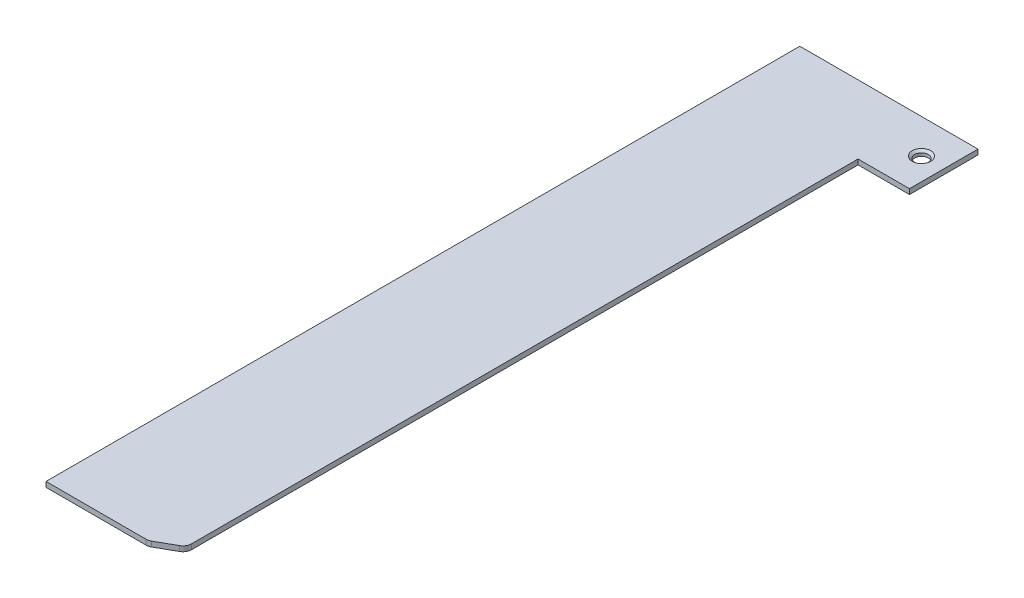
ISO-10303-21;
HEADER;
FILE_DESCRIPTION(('STEP AP214'),'2;1');
FILE_NAME('part.step','',(''),(''),'','','');
FILE_SCHEMA(('AUTOMOTIVE_DESIGN { 1 0 10303 214 1 1 1 1 }'));
ENDSEC;
DATA;
#1=APPLICATION_CONTEXT('core data for automotive mechanical design processes');
#2=APPLICATION_PROTOCOL_DEFINITION('international standard','automotive_design',2000,#1);
#3=PRODUCT_CONTEXT('',#1,'mechanical');
#4=PRODUCT('Part','Part','',(#3));
#5=PRODUCT_RELATED_PRODUCT_CATEGORY('part','',(#4));
#6=PRODUCT_DEFINITION_FORMATION('','',#4);
#7=PRODUCT_DEFINITION_CONTEXT('part definition',#1,'design');
#8=PRODUCT_DEFINITION('design','',#6,#7);
#9=PRODUCT_DEFINITION_SHAPE('','',#8);
#10=(LENGTH_UNIT() NAMED_UNIT(*) SI_UNIT(.MILLI.,.METRE.));
#11=(NAMED_UNIT(*) PLANE_ANGLE_UNIT() SI_UNIT($,.RADIAN.));
#12=(NAMED_UNIT(*) SI_UNIT($,.STERADIAN.) SOLID_ANGLE_UNIT());
#13=UNCERTAINTY_MEASURE_WITH_UNIT(LENGTH_MEASURE(1.E-05),#10,'distance_accuracy_value','');
#14=(GEOMETRIC_REPRESENTATION_CONTEXT(3) GLOBAL_UNCERTAINTY_ASSIGNED_CONTEXT((#13)) GLOBAL_UNIT_ASSIGNED_CONTEXT((#10,
#11,#12)) REPRESENTATION_CONTEXT('',''));
#15=CARTESIAN_POINT('',(0.,0.,0.));
#16=DIRECTION('',(0.,0.,1.));
#17=DIRECTION('',(1.,0.,0.));
#18=AXIS2_PLACEMENT_3D('',#15,#16,#17);
#19=CARTESIAN_POINT('',(21.4776794472939,10.,215.));
#20=DIRECTION('',(0.,-1.,0.));
#21=DIRECTION('',(0.,0.,-1.));
#22=AXIS2_PLACEMENT_3D('',#19,#20,#21);
#23=CYLINDRICAL_SURFACE('',#22,5.);
#24=DIRECTION('',(0.,-1.,0.));
#25=VECTOR('',#24,1.);
#26=CARTESIAN_POINT('',(23.9402681620457,10.,219.351512015608));
#27=LINE('',#26,#25);
#28=CARTESIAN_POINT('',(23.9402681620457,3.,219.351512015608));
#29=VERTEX_POINT('',#28);
#30=CARTESIAN_POINT('',(23.9402681620456,0.,219.351512015608));
#31=VERTEX_POINT('',#30);
#32=EDGE_CURVE('E143',#29,#31,#27,.T.);
#33=ORIENTED_EDGE('',*,*,#32,.F.);
#34=CARTESIAN_POINT('',(21.4776794472939,3.,215.));
#35=DIRECTION('',(0.,1.,0.));
#36=DIRECTION('',(0.,0.,1.));
#37=AXIS2_PLACEMENT_3D('',#34,#35,#36);
#38=CIRCLE('',#37,5.);
#39=CARTESIAN_POINT('',(21.4776794472939,3.,220.));
#40=VERTEX_POINT('',#39);
#41=EDGE_CURVE('E41',#40,#29,#38,.T.);
#42=ORIENTED_EDGE('',*,*,#41,.F.);
#43=DIRECTION('',(0.,-1.,0.));
#44=VECTOR('',#43,1.);
#45=CARTESIAN_POINT('',(21.4776794472939,3.,220.));
#46=LINE('',#45,#44);
#47=CARTESIAN_POINT('',(21.4776794472939,0.,220.));
#48=VERTEX_POINT('',#47);
#49=EDGE_CURVE('E146',#48,#40,#46,.F.);
#50=ORIENTED_EDGE('',*,*,#49,.F.);
#51=CARTESIAN_POINT('',(21.4776794472939,0.,215.));
#52=DIRECTION('',(0.,1.,0.));
#53=DIRECTION('',(0.,0.,1.));
#54=AXIS2_PLACEMENT_3D('',#51,#52,#53);
#55=CIRCLE('',#54,5.);
#56=EDGE_CURVE('E11',#31,#48,#55,.F.);
#57=ORIENTED_EDGE('',*,*,#56,.F.);
#58=EDGE_LOOP('',(#33,#42,#50,#57));
#59=FACE_BOUND('',#58,.T.);
#60=ADVANCED_FACE('F34',(#59),#23,.T.);
#61=CARTESIAN_POINT('',(32.,10.,209.045254212063));
#62=DIRECTION('',(0.,1.,0.));
#63=DIRECTION('',(0.,0.,1.));
#64=AXIS2_PLACEMENT_3D('',#61,#62,#63);
#65=CYLINDRICAL_SURFACE('',#64,5.);
#66=DIRECTION('',(0.,1.,0.));
#67=VECTOR('',#66,1.);
#68=CARTESIAN_POINT('',(34.4625887147518,10.,213.396766227671));
#69=LINE('',#68,#67);
#70=CARTESIAN_POINT('',(34.4625887147518,0.,213.396766227671));
#71=VERTEX_POINT('',#70);
#72=CARTESIAN_POINT('',(34.4625887147518,3.,213.396766227671));
#73=VERTEX_POINT('',#72);
#74=EDGE_CURVE('E129',#71,#73,#69,.T.);
#75=ORIENTED_EDGE('',*,*,#74,.F.);
#76=CARTESIAN_POINT('',(32.,0.,209.045254212063));
#77=DIRECTION('',(0.,1.,0.));
#78=DIRECTION('',(0.,0.,1.));
#79=AXIS2_PLACEMENT_3D('',#76,#77,#78);
#80=CIRCLE('',#79,5.);
#81=CARTESIAN_POINT('',(37.,0.,209.045254212063));
#82=VERTEX_POINT('',#81);
#83=EDGE_CURVE('E139',#82,#71,#80,.F.);
#84=ORIENTED_EDGE('',*,*,#83,.F.);
#85=DIRECTION('',(0.,1.,0.));
#86=VECTOR('',#85,1.);
#87=CARTESIAN_POINT('',(37.,3.,209.045254212063));
#88=LINE('',#87,#86);
#89=CARTESIAN_POINT('',(37.,3.,209.045254212063));
#90=VERTEX_POINT('',#89);
#91=EDGE_CURVE('E132',#90,#82,#88,.F.);
#92=ORIENTED_EDGE('',*,*,#91,.F.);
#93=CARTESIAN_POINT('',(32.,3.,209.045254212063));
#94=DIRECTION('',(0.,1.,0.));
#95=DIRECTION('',(0.,0.,1.));
#96=AXIS2_PLACEMENT_3D('',#93,#94,#95);
#97=CIRCLE('',#96,5.);
#98=EDGE_CURVE('E109',#73,#90,#97,.T.);
#99=ORIENTED_EDGE('',*,*,#98,.F.);
#100=EDGE_LOOP('',(#75,#84,#92,#99));
#101=FACE_BOUND('',#100,.T.);
#102=ADVANCED_FACE('F217',(#101),#65,.T.);
#103=CARTESIAN_POINT('',(37.,3.,-180.));
#104=DIRECTION('',(-1.,0.,0.));
#105=DIRECTION('',(0.,0.,1.));
#106=AXIS2_PLACEMENT_3D('',#103,#104,#105);
#107=PLANE('',#106);
#108=DIRECTION('',(0.,0.,-1.));
#109=VECTOR('',#108,1.);
#110=CARTESIAN_POINT('',(37.,3.,-180.));
#111=LINE('',#110,#109);
#112=CARTESIAN_POINT('',(37.,3.,-180.));
#113=VERTEX_POINT('',#112);
#114=EDGE_CURVE('E101',#90,#113,#111,.T.);
#115=ORIENTED_EDGE('',*,*,#114,.F.);
#116=ORIENTED_EDGE('',*,*,#91,.T.);
#117=DIRECTION('',(0.,0.,-1.));
#118=VECTOR('',#117,1.);
#119=CARTESIAN_POINT('',(37.,0.,-180.));
#120=LINE('',#119,#118);
#121=CARTESIAN_POINT('',(37.,0.,-180.));
#122=VERTEX_POINT('',#121);
#123=EDGE_CURVE('E127',#82,#122,#120,.T.);
#124=ORIENTED_EDGE('',*,*,#123,.T.);
#125=DIRECTION('',(0.,-1.,0.));
#126=VECTOR('',#125,1.);
#127=CARTESIAN_POINT('',(37.,3.,-180.));
#128=LINE('',#127,#126);
#129=EDGE_CURVE('E119',#113,#122,#128,.T.);
#130=ORIENTED_EDGE('',*,*,#129,.F.);
#131=EDGE_LOOP('',(#115,#116,#124,#130));
#132=FACE_BOUND('',#131,.T.);
#133=ADVANCED_FACE('F125',(#132),#107,.F.);
#134=CARTESIAN_POINT('',(67.,3.,-180.));
#135=DIRECTION('',(0.,0.,-1.));
#136=DIRECTION('',(-1.,0.,0.));
#137=AXIS2_PLACEMENT_3D('',#134,#135,#136);
#138=PLANE('',#137);
#139=DIRECTION('',(1.,0.,0.));
#140=VECTOR('',#139,1.);
#141=CARTESIAN_POINT('',(67.,0.,-180.));
#142=LINE('',#141,#140);
#143=CARTESIAN_POINT('',(67.,0.,-180.));
#144=VERTEX_POINT('',#143);
#145=EDGE_CURVE('E175',#122,#144,#142,.T.);
#146=ORIENTED_EDGE('',*,*,#145,.T.);
#147=DIRECTION('',(0.,-1.,0.));
#148=VECTOR('',#147,1.);
#149=CARTESIAN_POINT('',(67.,3.,-180.));
#150=LINE('',#149,#148);
#151=CARTESIAN_POINT('',(67.,3.,-180.));
#152=VERTEX_POINT('',#151);
#153=EDGE_CURVE('E121',#152,#144,#150,.T.);
#154=ORIENTED_EDGE('',*,*,#153,.F.);
#155=DIRECTION('',(1.,0.,0.));
#156=VECTOR('',#155,1.);
#157=CARTESIAN_POINT('',(67.,3.,-180.));
#158=LINE('',#157,#156);
#159=EDGE_CURVE('E106',#113,#152,#158,.T.);
#160=ORIENTED_EDGE('',*,*,#159,.F.);
#161=ORIENTED_EDGE('',*,*,#129,.T.);
#162=EDGE_LOOP('',(#146,#154,#160,#161));
#163=FACE_BOUND('',#162,.T.);
#164=ADVANCED_FACE('F118',(#163),#138,.F.);
#165=CARTESIAN_POINT('',(67.,3.,-220.));
#166=DIRECTION('',(-1.,0.,0.));
#167=DIRECTION('',(0.,0.,1.));
#168=AXIS2_PLACEMENT_3D('',#165,#166,#167);
#169=PLANE('',#168);
#170=DIRECTION('',(0.,0.,-1.));
#171=VECTOR('',#170,1.);
#172=CARTESIAN_POINT('',(67.,0.,-220.));
#173=LINE('',#172,#171);
#174=CARTESIAN_POINT('',(67.,0.,-220.));
#175=VERTEX_POINT('',#174);
#176=EDGE_CURVE('E177',#144,#175,#173,.T.);
#177=ORIENTED_EDGE('',*,*,#176,.T.);
#178=DIRECTION('',(0.,-1.,0.));
#179=VECTOR('',#178,1.);
#180=CARTESIAN_POINT('',(67.,3.,-220.));
#181=LINE('',#180,#179);
#182=CARTESIAN_POINT('',(67.,3.,-220.));
#183=VERTEX_POINT('',#182);
#184=EDGE_CURVE('E134',#183,#175,#181,.T.);
#185=ORIENTED_EDGE('',*,*,#184,.F.);
#186=DIRECTION('',(0.,0.,-1.));
#187=VECTOR('',#186,1.);
#188=CARTESIAN_POINT('',(67.,3.,-220.));
#189=LINE('',#188,#187);
#190=EDGE_CURVE('E123',#152,#183,#189,.T.);
#191=ORIENTED_EDGE('',*,*,#190,.F.);
#192=ORIENTED_EDGE('',*,*,#153,.T.);
#193=EDGE_LOOP('',(#177,#185,#191,#192));
#194=FACE_BOUND('',#193,.T.);
#195=ADVANCED_FACE('F197',(#194),#169,.F.);
#196=CARTESIAN_POINT('',(-37.,3.,-220.));
#197=DIRECTION('',(0.,0.,1.));
#198=DIRECTION('',(1.,0.,0.));
#199=AXIS2_PLACEMENT_3D('',#196,#197,#198);
#200=PLANE('',#199);
#201=DIRECTION('',(-1.,0.,0.));
#202=VECTOR('',#201,1.);
#203=CARTESIAN_POINT('',(-37.,0.,-220.));
#204=LINE('',#203,#202);
#205=CARTESIAN_POINT('',(-37.,0.,-220.));
#206=VERTEX_POINT('',#205);
#207=EDGE_CURVE('E180',#175,#206,#204,.T.);
#208=ORIENTED_EDGE('',*,*,#207,.T.);
#209=DIRECTION('',(0.,-1.,0.));
#210=VECTOR('',#209,1.);
#211=CARTESIAN_POINT('',(-37.,3.,-220.));
#212=LINE('',#211,#210);
#213=CARTESIAN_POINT('',(-37.,3.,-220.));
#214=VERTEX_POINT('',#213);
#215=EDGE_CURVE('E188',#214,#206,#212,.T.);
#216=ORIENTED_EDGE('',*,*,#215,.F.);
#217=DIRECTION('',(-1.,0.,0.));
#218=VECTOR('',#217,1.);
#219=CARTESIAN_POINT('',(37.,3.,-220.));
#220=LINE('',#219,#218);
#221=EDGE_CURVE('E168',#183,#214,#220,.T.);
#222=ORIENTED_EDGE('',*,*,#221,.F.);
#223=ORIENTED_EDGE('',*,*,#184,.T.);
#224=EDGE_LOOP('',(#208,#216,#222,#223));
#225=FACE_BOUND('',#224,.T.);
#226=ADVANCED_FACE('F194',(#225),#200,.F.);
#227=CARTESIAN_POINT('',(-37.,3.,-220.));
#228=DIRECTION('',(1.,0.,0.));
#229=DIRECTION('',(0.,0.,-1.));
#230=AXIS2_PLACEMENT_3D('',#227,#228,#229);
#231=PLANE('',#230);
#232=DIRECTION('',(0.,0.,1.));
#233=VECTOR('',#232,1.);
#234=CARTESIAN_POINT('',(-37.,0.,-220.));
#235=LINE('',#234,#233);
#236=CARTESIAN_POINT('',(-37.,0.,220.));
#237=VERTEX_POINT('',#236);
#238=EDGE_CURVE('E182',#206,#237,#235,.T.);
#239=ORIENTED_EDGE('',*,*,#238,.T.);
#240=DIRECTION('',(0.,-1.,0.));
#241=VECTOR('',#240,1.);
#242=CARTESIAN_POINT('',(-37.,3.,220.));
#243=LINE('',#242,#241);
#244=CARTESIAN_POINT('',(-37.,3.,220.));
#245=VERTEX_POINT('',#244);
#246=EDGE_CURVE('E173',#245,#237,#243,.T.);
#247=ORIENTED_EDGE('',*,*,#246,.F.);
#248=DIRECTION('',(0.,0.,1.));
#249=VECTOR('',#248,1.);
#250=CARTESIAN_POINT('',(-37.,3.,-220.));
#251=LINE('',#250,#249);
#252=EDGE_CURVE('E170',#214,#245,#251,.T.);
#253=ORIENTED_EDGE('',*,*,#252,.F.);
#254=ORIENTED_EDGE('',*,*,#215,.T.);
#255=EDGE_LOOP('',(#239,#247,#253,#254));
#256=FACE_BOUND('',#255,.T.);
#257=ADVANCED_FACE('F203',(#256),#231,.F.);
#258=CARTESIAN_POINT('',(-37.,3.,220.));
#259=DIRECTION('',(0.,0.,-1.));
#260=DIRECTION('',(-1.,0.,0.));
#261=AXIS2_PLACEMENT_3D('',#258,#259,#260);
#262=PLANE('',#261);
#263=DIRECTION('',(1.,0.,0.));
#264=VECTOR('',#263,1.);
#265=CARTESIAN_POINT('',(-37.,0.,220.));
#266=LINE('',#265,#264);
#267=EDGE_CURVE('E114',#237,#48,#266,.T.);
#268=ORIENTED_EDGE('',*,*,#267,.T.);
#269=ORIENTED_EDGE('',*,*,#49,.T.);
#270=DIRECTION('',(1.,0.,0.));
#271=VECTOR('',#270,1.);
#272=CARTESIAN_POINT('',(-37.,3.,220.));
#273=LINE('',#272,#271);
#274=EDGE_CURVE('E150',#245,#40,#273,.T.);
#275=ORIENTED_EDGE('',*,*,#274,.F.);
#276=ORIENTED_EDGE('',*,*,#246,.T.);
#277=EDGE_LOOP('',(#268,#269,#275,#276));
#278=FACE_BOUND('',#277,.T.);
#279=ADVANCED_FACE('F206',(#278),#262,.F.);
#280=CARTESIAN_POINT('',(0.,3.,0.));
#281=DIRECTION('',(0.,1.,0.));
#282=DIRECTION('',(0.,0.,1.));
#283=AXIS2_PLACEMENT_3D('',#280,#281,#282);
#284=PLANE('',#283);
#285=ORIENTED_EDGE('',*,*,#274,.T.);
#286=ORIENTED_EDGE('',*,*,#41,.T.);
#287=DIRECTION('',(-0.870302403121518,0.,0.492517742950355));
#288=VECTOR('',#287,1.);
#289=CARTESIAN_POINT('',(99.8299751511711,3.,176.404339785142));
#290=LINE('',#289,#288);
#291=EDGE_CURVE('E148',#73,#29,#290,.T.);
#292=ORIENTED_EDGE('',*,*,#291,.F.);
#293=ORIENTED_EDGE('',*,*,#98,.T.);
#294=ORIENTED_EDGE('',*,*,#114,.T.);
#295=ORIENTED_EDGE('',*,*,#159,.T.);
#296=ORIENTED_EDGE('',*,*,#190,.T.);
#297=ORIENTED_EDGE('',*,*,#221,.T.);
#298=ORIENTED_EDGE('',*,*,#252,.T.);
#299=EDGE_LOOP('',(#285,#286,#292,#293,#294,#295,#296,#297,#298));
#300=FACE_BOUND('',#299,.T.);
#301=CARTESIAN_POINT('',(54.,3.,-200.));
#302=DIRECTION('',(0.,1.,0.));
#303=DIRECTION('',(0.,0.,1.));
#304=AXIS2_PLACEMENT_3D('',#301,#302,#303);
#305=CIRCLE('',#304,5.3975);
#306=CARTESIAN_POINT('',(54.,3.,-194.6025));
#307=VERTEX_POINT('',#306);
#308=EDGE_CURVE('E154',#307,#307,#305,.T.);
#309=ORIENTED_EDGE('',*,*,#308,.F.);
#310=EDGE_LOOP('',(#309));
#311=FACE_BOUND('',#310,.T.);
#312=ADVANCED_FACE('F104',(#300,#311),#284,.T.);
#313=CARTESIAN_POINT('',(0.,0.,0.));
#314=DIRECTION('',(0.,1.,0.));
#315=DIRECTION('',(0.,0.,1.));
#316=AXIS2_PLACEMENT_3D('',#313,#314,#315);
#317=PLANE('',#316);
#318=CARTESIAN_POINT('',(54.,0.,-200.));
#319=DIRECTION('',(0.,1.,0.));
#320=DIRECTION('',(0.,0.,1.));
#321=AXIS2_PLACEMENT_3D('',#318,#319,#320);
#322=CIRCLE('',#321,3.96875);
#323=CARTESIAN_POINT('',(54.,0.,-196.03125));
#324=VERTEX_POINT('',#323);
#325=EDGE_CURVE('E164',#324,#324,#322,.T.);
#326=ORIENTED_EDGE('',*,*,#325,.T.);
#327=EDGE_LOOP('',(#326));
#328=FACE_BOUND('',#327,.T.);
#329=DIRECTION('',(0.870302403121518,0.,-0.492517742950355));
#330=VECTOR('',#329,1.);
#331=CARTESIAN_POINT('',(37.,0.,211.96080549188));
#332=LINE('',#331,#330);
#333=EDGE_CURVE('E155',#31,#71,#332,.T.);
#334=ORIENTED_EDGE('',*,*,#333,.F.);
#335=ORIENTED_EDGE('',*,*,#56,.T.);
#336=ORIENTED_EDGE('',*,*,#267,.F.);
#337=ORIENTED_EDGE('',*,*,#238,.F.);
#338=ORIENTED_EDGE('',*,*,#207,.F.);
#339=ORIENTED_EDGE('',*,*,#176,.F.);
#340=ORIENTED_EDGE('',*,*,#145,.F.);
#341=ORIENTED_EDGE('',*,*,#123,.F.);
#342=ORIENTED_EDGE('',*,*,#83,.T.);
#343=EDGE_LOOP('',(#334,#335,#336,#337,#338,#339,#340,#341,#342));
#344=FACE_BOUND('',#343,.T.);
#345=ADVANCED_FACE('F199',(#328,#344),#317,.F.);
#346=CARTESIAN_POINT('',(54.,3.,-200.));
#347=DIRECTION('',(0.,1.,0.));
#348=DIRECTION('',(0.,0.,1.));
#349=AXIS2_PLACEMENT_3D('',#346,#347,#348);
#350=CYLINDRICAL_SURFACE('',#349,3.96875);
#351=ORIENTED_EDGE('',*,*,#325,.F.);
#352=EDGE_LOOP('',(#351));
#353=FACE_BOUND('',#352,.T.);
#354=CARTESIAN_POINT('',(54.,1.80113640195546,-200.));
#355=DIRECTION('',(0.,1.,0.));
#356=DIRECTION('',(0.,0.,1.));
#357=AXIS2_PLACEMENT_3D('',#354,#355,#356);
#358=CIRCLE('',#357,3.96875);
#359=CARTESIAN_POINT('',(54.,1.80113640195546,-196.03125));
#360=VERTEX_POINT('',#359);
#361=EDGE_CURVE('E158',#360,#360,#358,.T.);
#362=ORIENTED_EDGE('',*,*,#361,.T.);
#363=EDGE_LOOP('',(#362));
#364=FACE_BOUND('',#363,.T.);
#365=ADVANCED_FACE('F246',(#353,#364),#350,.F.);
#366=CARTESIAN_POINT('',(54.,3.,-200.));
#367=DIRECTION('',(0.,1.,0.));
#368=DIRECTION('',(0.,0.,1.));
#369=AXIS2_PLACEMENT_3D('',#366,#367,#368);
#370=CONICAL_SURFACE('',#369,5.3975,0.872664625997164);
#371=ORIENTED_EDGE('',*,*,#361,.F.);
#372=EDGE_LOOP('',(#371));
#373=FACE_BOUND('',#372,.T.);
#374=ORIENTED_EDGE('',*,*,#308,.T.);
#375=EDGE_LOOP('',(#374));
#376=FACE_BOUND('',#375,.T.);
#377=ADVANCED_FACE('F251',(#373,#376),#370,.F.);
#378=CARTESIAN_POINT('',(37.,10.,211.96080549188));
#379=DIRECTION('',(-0.492517742950355,0.,-0.870302403121518));
#380=DIRECTION('',(-0.870302403121518,0.,0.492517742950355));
#381=AXIS2_PLACEMENT_3D('',#378,#379,#380);
#382=PLANE('',#381);
#383=ORIENTED_EDGE('',*,*,#291,.T.);
#384=ORIENTED_EDGE('',*,*,#32,.T.);
#385=ORIENTED_EDGE('',*,*,#333,.T.);
#386=ORIENTED_EDGE('',*,*,#74,.T.);
#387=EDGE_LOOP('',(#383,#384,#385,#386));
#388=FACE_BOUND('',#387,.T.);
#389=ADVANCED_FACE('F152',(#388),#382,.F.);
#390=CLOSED_SHELL('',(#60,#102,#133,#164,#195,#226,#257,#279,#312,#345,#365,#377,#389));
#391=MANIFOLD_SOLID_BREP('B2',#390);
#392=ADVANCED_BREP_SHAPE_REPRESENTATION('',(#18,#391),#14);
#393=SHAPE_DEFINITION_REPRESENTATION(#9,#392);
ENDSEC;
END-ISO-10303-21;
